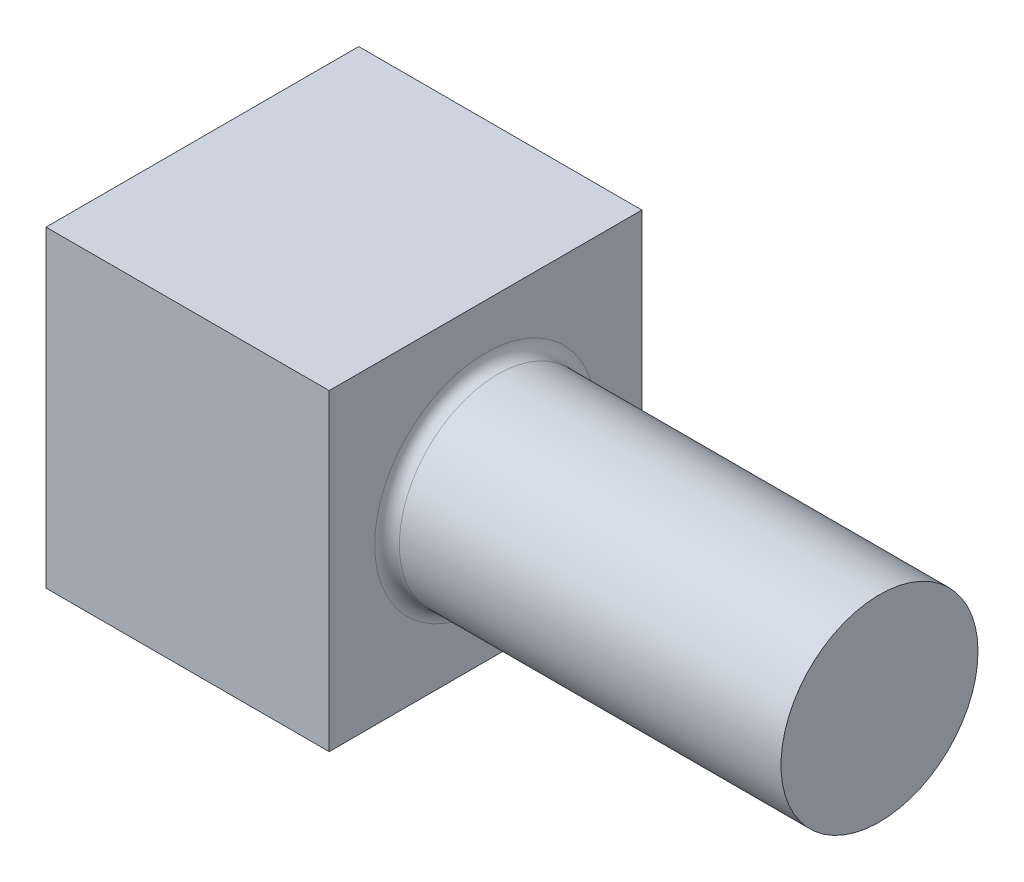
ISO-10303-21;
HEADER;
FILE_DESCRIPTION(('STEP AP214'),'2;1');
FILE_NAME('part.step','',(''),(''),'','','');
FILE_SCHEMA(('AUTOMOTIVE_DESIGN { 1 0 10303 214 1 1 1 1 }'));
ENDSEC;
DATA;
#1=APPLICATION_CONTEXT('core data for automotive mechanical design processes');
#2=APPLICATION_PROTOCOL_DEFINITION('international standard','automotive_design',2000,#1);
#3=PRODUCT_CONTEXT('',#1,'mechanical');
#4=PRODUCT('Part','Part','',(#3));
#5=PRODUCT_RELATED_PRODUCT_CATEGORY('part','',(#4));
#6=PRODUCT_DEFINITION_FORMATION('','',#4);
#7=PRODUCT_DEFINITION_CONTEXT('part definition',#1,'design');
#8=PRODUCT_DEFINITION('design','',#6,#7);
#9=PRODUCT_DEFINITION_SHAPE('','',#8);
#10=(LENGTH_UNIT() NAMED_UNIT(*) SI_UNIT(.MILLI.,.METRE.));
#11=(NAMED_UNIT(*) PLANE_ANGLE_UNIT() SI_UNIT($,.RADIAN.));
#12=(NAMED_UNIT(*) SI_UNIT($,.STERADIAN.) SOLID_ANGLE_UNIT());
#13=UNCERTAINTY_MEASURE_WITH_UNIT(LENGTH_MEASURE(1.E-05),#10,'distance_accuracy_value','');
#14=(GEOMETRIC_REPRESENTATION_CONTEXT(3) GLOBAL_UNCERTAINTY_ASSIGNED_CONTEXT((#13)) GLOBAL_UNIT_ASSIGNED_CONTEXT((#10,
#11,#12)) REPRESENTATION_CONTEXT('',''));
#15=CARTESIAN_POINT('',(0.,0.,0.));
#16=DIRECTION('',(0.,0.,1.));
#17=DIRECTION('',(1.,0.,0.));
#18=AXIS2_PLACEMENT_3D('',#15,#16,#17);
#19=CARTESIAN_POINT('',(12.,0.,0.));
#20=DIRECTION('',(1.,0.,0.));
#21=DIRECTION('',(0.,0.,-1.));
#22=AXIS2_PLACEMENT_3D('',#19,#20,#21);
#23=PLANE('',#22);
#24=CARTESIAN_POINT('',(12.,0.,0.));
#25=DIRECTION('',(1.,0.,0.));
#26=DIRECTION('',(0.,0.,-1.));
#27=AXIS2_PLACEMENT_3D('',#24,#25,#26);
#28=CIRCLE('',#27,4.5);
#29=CARTESIAN_POINT('',(12.,0.,-4.5));
#30=VERTEX_POINT('',#29);
#31=EDGE_CURVE('E118',#30,#30,#28,.F.);
#32=ORIENTED_EDGE('',*,*,#31,.T.);
#33=EDGE_LOOP('',(#32));
#34=FACE_BOUND('',#33,.T.);
#35=DIRECTION('',(0.,-1.,0.));
#36=VECTOR('',#35,1.);
#37=CARTESIAN_POINT('',(12.,6.35,6.35));
#38=LINE('',#37,#36);
#39=CARTESIAN_POINT('',(12.,6.35,6.35));
#40=VERTEX_POINT('',#39);
#41=CARTESIAN_POINT('',(12.,-6.35,6.35));
#42=VERTEX_POINT('',#41);
#43=EDGE_CURVE('E105',#40,#42,#38,.T.);
#44=ORIENTED_EDGE('',*,*,#43,.T.);
#45=DIRECTION('',(0.,0.,-1.));
#46=VECTOR('',#45,1.);
#47=CARTESIAN_POINT('',(12.,-6.35,6.35));
#48=LINE('',#47,#46);
#49=CARTESIAN_POINT('',(12.,-6.35,-6.35));
#50=VERTEX_POINT('',#49);
#51=EDGE_CURVE('E94',#42,#50,#48,.T.);
#52=ORIENTED_EDGE('',*,*,#51,.T.);
#53=DIRECTION('',(0.,1.,0.));
#54=VECTOR('',#53,1.);
#55=CARTESIAN_POINT('',(12.,6.35,-6.35));
#56=LINE('',#55,#54);
#57=CARTESIAN_POINT('',(12.,6.35,-6.35));
#58=VERTEX_POINT('',#57);
#59=EDGE_CURVE('E104',#50,#58,#56,.T.);
#60=ORIENTED_EDGE('',*,*,#59,.T.);
#61=DIRECTION('',(0.,0.,1.));
#62=VECTOR('',#61,1.);
#63=CARTESIAN_POINT('',(12.,6.35,6.35));
#64=LINE('',#63,#62);
#65=EDGE_CURVE('E109',#58,#40,#64,.T.);
#66=ORIENTED_EDGE('',*,*,#65,.T.);
#67=EDGE_LOOP('',(#44,#52,#60,#66));
#68=FACE_BOUND('',#67,.T.);
#69=ADVANCED_FACE('F38',(#34,#68),#23,.T.);
#70=CARTESIAN_POINT('',(12.,6.35,6.35));
#71=DIRECTION('',(0.,0.,-1.));
#72=DIRECTION('',(0.,1.,0.));
#73=AXIS2_PLACEMENT_3D('',#70,#71,#72);
#74=PLANE('',#73);
#75=DIRECTION('',(-1.,0.,0.));
#76=VECTOR('',#75,1.);
#77=CARTESIAN_POINT('',(12.,6.35,6.35));
#78=LINE('',#77,#76);
#79=CARTESIAN_POINT('',(0.500000000000007,6.35,6.35));
#80=VERTEX_POINT('',#79);
#81=EDGE_CURVE('E158',#40,#80,#78,.T.);
#82=ORIENTED_EDGE('',*,*,#81,.T.);
#83=DIRECTION('',(0.,-1.,0.));
#84=VECTOR('',#83,1.);
#85=CARTESIAN_POINT('',(0.500000000000007,6.35,6.35));
#86=LINE('',#85,#84);
#87=CARTESIAN_POINT('',(0.500000000000007,-6.35,6.35));
#88=VERTEX_POINT('',#87);
#89=EDGE_CURVE('E11',#80,#88,#86,.T.);
#90=ORIENTED_EDGE('',*,*,#89,.T.);
#91=DIRECTION('',(-1.,0.,0.));
#92=VECTOR('',#91,1.);
#93=CARTESIAN_POINT('',(12.,-6.35,6.35));
#94=LINE('',#93,#92);
#95=EDGE_CURVE('E99',#42,#88,#94,.T.);
#96=ORIENTED_EDGE('',*,*,#95,.F.);
#97=ORIENTED_EDGE('',*,*,#43,.F.);
#98=EDGE_LOOP('',(#82,#90,#96,#97));
#99=FACE_BOUND('',#98,.T.);
#100=ADVANCED_FACE('F113',(#99),#74,.F.);
#101=CARTESIAN_POINT('',(12.,-6.35,6.35));
#102=DIRECTION('',(0.,1.,0.));
#103=DIRECTION('',(0.,0.,1.));
#104=AXIS2_PLACEMENT_3D('',#101,#102,#103);
#105=PLANE('',#104);
#106=ORIENTED_EDGE('',*,*,#95,.T.);
#107=DIRECTION('',(0.,0.,-1.));
#108=VECTOR('',#107,1.);
#109=CARTESIAN_POINT('',(0.500000000000007,-6.35,6.35));
#110=LINE('',#109,#108);
#111=CARTESIAN_POINT('',(0.500000000000007,-6.35,-6.35));
#112=VERTEX_POINT('',#111);
#113=EDGE_CURVE('E126',#88,#112,#110,.T.);
#114=ORIENTED_EDGE('',*,*,#113,.T.);
#115=DIRECTION('',(-1.,0.,0.));
#116=VECTOR('',#115,1.);
#117=CARTESIAN_POINT('',(12.,-6.35,-6.35));
#118=LINE('',#117,#116);
#119=EDGE_CURVE('E101',#50,#112,#118,.T.);
#120=ORIENTED_EDGE('',*,*,#119,.F.);
#121=ORIENTED_EDGE('',*,*,#51,.F.);
#122=EDGE_LOOP('',(#106,#114,#120,#121));
#123=FACE_BOUND('',#122,.T.);
#124=ADVANCED_FACE('F96',(#123),#105,.F.);
#125=CARTESIAN_POINT('',(12.,6.35,-6.35));
#126=DIRECTION('',(0.,0.,1.));
#127=DIRECTION('',(0.,-1.,0.));
#128=AXIS2_PLACEMENT_3D('',#125,#126,#127);
#129=PLANE('',#128);
#130=ORIENTED_EDGE('',*,*,#119,.T.);
#131=DIRECTION('',(0.,1.,0.));
#132=VECTOR('',#131,1.);
#133=CARTESIAN_POINT('',(0.500000000000007,6.35,-6.35));
#134=LINE('',#133,#132);
#135=CARTESIAN_POINT('',(0.500000000000007,6.35,-6.35));
#136=VERTEX_POINT('',#135);
#137=EDGE_CURVE('E62',#112,#136,#134,.T.);
#138=ORIENTED_EDGE('',*,*,#137,.T.);
#139=DIRECTION('',(-1.,0.,0.));
#140=VECTOR('',#139,1.);
#141=CARTESIAN_POINT('',(12.,6.35,-6.35));
#142=LINE('',#141,#140);
#143=EDGE_CURVE('E120',#58,#136,#142,.T.);
#144=ORIENTED_EDGE('',*,*,#143,.F.);
#145=ORIENTED_EDGE('',*,*,#59,.F.);
#146=EDGE_LOOP('',(#130,#138,#144,#145));
#147=FACE_BOUND('',#146,.T.);
#148=ADVANCED_FACE('F168',(#147),#129,.F.);
#149=CARTESIAN_POINT('',(12.,6.35,6.35));
#150=DIRECTION('',(0.,-1.,0.));
#151=DIRECTION('',(0.,0.,-1.));
#152=AXIS2_PLACEMENT_3D('',#149,#150,#151);
#153=PLANE('',#152);
#154=ORIENTED_EDGE('',*,*,#143,.T.);
#155=DIRECTION('',(0.,0.,1.));
#156=VECTOR('',#155,1.);
#157=CARTESIAN_POINT('',(0.500000000000007,6.35,6.35));
#158=LINE('',#157,#156);
#159=EDGE_CURVE('E47',#136,#80,#158,.T.);
#160=ORIENTED_EDGE('',*,*,#159,.T.);
#161=ORIENTED_EDGE('',*,*,#81,.F.);
#162=ORIENTED_EDGE('',*,*,#65,.F.);
#163=EDGE_LOOP('',(#154,#160,#161,#162));
#164=FACE_BOUND('',#163,.T.);
#165=ADVANCED_FACE('F159',(#164),#153,.F.);
#166=CARTESIAN_POINT('',(0.,0.,0.));
#167=DIRECTION('',(1.,0.,0.));
#168=DIRECTION('',(0.,0.,-1.));
#169=AXIS2_PLACEMENT_3D('',#166,#167,#168);
#170=PLANE('',#169);
#171=DIRECTION('',(0.,-1.,0.));
#172=VECTOR('',#171,1.);
#173=CARTESIAN_POINT('',(0.,0.,-5.84999999999999));
#174=LINE('',#173,#172);
#175=CARTESIAN_POINT('',(0.,5.84999999999999,-5.84999999999999));
#176=VERTEX_POINT('',#175);
#177=CARTESIAN_POINT('',(0.,-5.84999999999999,-5.84999999999999));
#178=VERTEX_POINT('',#177);
#179=EDGE_CURVE('E132',#176,#178,#174,.T.);
#180=ORIENTED_EDGE('',*,*,#179,.T.);
#181=DIRECTION('',(0.,0.,1.));
#182=VECTOR('',#181,1.);
#183=CARTESIAN_POINT('',(0.,-5.84999999999999,0.));
#184=LINE('',#183,#182);
#185=CARTESIAN_POINT('',(0.,-5.84999999999999,5.84999999999999));
#186=VERTEX_POINT('',#185);
#187=EDGE_CURVE('E134',#178,#186,#184,.T.);
#188=ORIENTED_EDGE('',*,*,#187,.T.);
#189=DIRECTION('',(0.,1.,0.));
#190=VECTOR('',#189,1.);
#191=CARTESIAN_POINT('',(0.,0.,5.84999999999999));
#192=LINE('',#191,#190);
#193=CARTESIAN_POINT('',(0.,5.84999999999999,5.84999999999999));
#194=VERTEX_POINT('',#193);
#195=EDGE_CURVE('E128',#186,#194,#192,.T.);
#196=ORIENTED_EDGE('',*,*,#195,.T.);
#197=DIRECTION('',(0.,0.,-1.));
#198=VECTOR('',#197,1.);
#199=CARTESIAN_POINT('',(0.,5.84999999999999,0.));
#200=LINE('',#199,#198);
#201=EDGE_CURVE('E130',#194,#176,#200,.T.);
#202=ORIENTED_EDGE('',*,*,#201,.T.);
#203=EDGE_LOOP('',(#180,#188,#196,#202));
#204=FACE_BOUND('',#203,.T.);
#205=ADVANCED_FACE('F175',(#204),#170,.F.);
#206=CARTESIAN_POINT('',(28.,0.,0.));
#207=DIRECTION('',(-1.,0.,0.));
#208=DIRECTION('',(0.,0.,1.));
#209=AXIS2_PLACEMENT_3D('',#206,#207,#208);
#210=CYLINDRICAL_SURFACE('',#209,4.);
#211=CARTESIAN_POINT('',(12.5,0.,0.));
#212=DIRECTION('',(1.,0.,0.));
#213=DIRECTION('',(0.,0.,-1.));
#214=AXIS2_PLACEMENT_3D('',#211,#212,#213);
#215=CIRCLE('',#214,4.);
#216=CARTESIAN_POINT('',(12.5,0.,-4.));
#217=VERTEX_POINT('',#216);
#218=EDGE_CURVE('E115',#217,#217,#215,.T.);
#219=ORIENTED_EDGE('',*,*,#218,.T.);
#220=EDGE_LOOP('',(#219));
#221=FACE_BOUND('',#220,.T.);
#222=CARTESIAN_POINT('',(28.,0.,0.));
#223=DIRECTION('',(1.,0.,0.));
#224=DIRECTION('',(0.,0.,-1.));
#225=AXIS2_PLACEMENT_3D('',#222,#223,#224);
#226=CIRCLE('',#225,4.);
#227=CARTESIAN_POINT('',(28.,0.,-4.));
#228=VERTEX_POINT('',#227);
#229=EDGE_CURVE('E111',#228,#228,#226,.T.);
#230=ORIENTED_EDGE('',*,*,#229,.F.);
#231=EDGE_LOOP('',(#230));
#232=FACE_BOUND('',#231,.T.);
#233=ADVANCED_FACE('F187',(#221,#232),#210,.T.);
#234=CARTESIAN_POINT('',(28.,0.,0.));
#235=DIRECTION('',(1.,0.,0.));
#236=DIRECTION('',(0.,0.,-1.));
#237=AXIS2_PLACEMENT_3D('',#234,#235,#236);
#238=PLANE('',#237);
#239=ORIENTED_EDGE('',*,*,#229,.T.);
#240=EDGE_LOOP('',(#239));
#241=FACE_BOUND('',#240,.T.);
#242=ADVANCED_FACE('F194',(#241),#238,.T.);
#243=CARTESIAN_POINT('',(12.5,0.,0.));
#244=DIRECTION('',(1.,0.,0.));
#245=DIRECTION('',(0.,0.,-1.));
#246=AXIS2_PLACEMENT_3D('',#243,#244,#245);
#247=TOROIDAL_SURFACE('',#246,4.5,0.5);
#248=ORIENTED_EDGE('',*,*,#31,.F.);
#249=EDGE_LOOP('',(#248));
#250=FACE_BOUND('',#249,.T.);
#251=ORIENTED_EDGE('',*,*,#218,.F.);
#252=EDGE_LOOP('',(#251));
#253=FACE_BOUND('',#252,.T.);
#254=ADVANCED_FACE('F205',(#250,#253),#247,.F.);
#255=CARTESIAN_POINT('',(0.500000000000007,6.35,6.35));
#256=DIRECTION('',(0.70710678118655,-0.707106781186545,0.));
#257=DIRECTION('',(0.,0.,1.));
#258=AXIS2_PLACEMENT_3D('',#255,#256,#257);
#259=PLANE('',#258);
#260=DIRECTION('',(-0.577350269189623,-0.577350269189627,0.577350269189627));
#261=VECTOR('',#260,1.);
#262=CARTESIAN_POINT('',(-3.73333333333332,2.11666666666665,-2.11666666666665));
#263=LINE('',#262,#261);
#264=EDGE_CURVE('E142',#176,#136,#263,.F.);
#265=ORIENTED_EDGE('',*,*,#264,.F.);
#266=ORIENTED_EDGE('',*,*,#201,.F.);
#267=DIRECTION('',(-0.577350269189623,-0.577350269189627,-0.577350269189627));
#268=VECTOR('',#267,1.);
#269=CARTESIAN_POINT('',(0.500000000000007,6.35,6.35));
#270=LINE('',#269,#268);
#271=EDGE_CURVE('E42',#80,#194,#270,.T.);
#272=ORIENTED_EDGE('',*,*,#271,.F.);
#273=ORIENTED_EDGE('',*,*,#159,.F.);
#274=EDGE_LOOP('',(#265,#266,#272,#273));
#275=FACE_BOUND('',#274,.T.);
#276=ADVANCED_FACE('F40',(#275),#259,.F.);
#277=CARTESIAN_POINT('',(0.500000000000007,6.35,6.35));
#278=DIRECTION('',(0.70710678118655,0.,-0.707106781186545));
#279=DIRECTION('',(0.,-1.,0.));
#280=AXIS2_PLACEMENT_3D('',#277,#278,#279);
#281=PLANE('',#280);
#282=ORIENTED_EDGE('',*,*,#271,.T.);
#283=ORIENTED_EDGE('',*,*,#195,.F.);
#284=DIRECTION('',(0.577350269189623,-0.577350269189627,0.577350269189627));
#285=VECTOR('',#284,1.);
#286=CARTESIAN_POINT('',(-3.73333333333332,-2.11666666666665,2.11666666666665));
#287=LINE('',#286,#285);
#288=EDGE_CURVE('E141',#88,#186,#287,.F.);
#289=ORIENTED_EDGE('',*,*,#288,.F.);
#290=ORIENTED_EDGE('',*,*,#89,.F.);
#291=EDGE_LOOP('',(#282,#283,#289,#290));
#292=FACE_BOUND('',#291,.T.);
#293=ADVANCED_FACE('F162',(#292),#281,.F.);
#294=CARTESIAN_POINT('',(0.500000000000007,6.35,-6.35));
#295=DIRECTION('',(0.70710678118655,0.,0.707106781186545));
#296=DIRECTION('',(0.,1.,0.));
#297=AXIS2_PLACEMENT_3D('',#294,#295,#296);
#298=PLANE('',#297);
#299=ORIENTED_EDGE('',*,*,#264,.T.);
#300=ORIENTED_EDGE('',*,*,#137,.F.);
#301=DIRECTION('',(-0.577350269189623,0.577350269189627,0.577350269189627));
#302=VECTOR('',#301,1.);
#303=CARTESIAN_POINT('',(-3.73333333333332,-2.11666666666665,-2.11666666666665));
#304=LINE('',#303,#302);
#305=EDGE_CURVE('E139',#178,#112,#304,.F.);
#306=ORIENTED_EDGE('',*,*,#305,.F.);
#307=ORIENTED_EDGE('',*,*,#179,.F.);
#308=EDGE_LOOP('',(#299,#300,#306,#307));
#309=FACE_BOUND('',#308,.T.);
#310=ADVANCED_FACE('F196',(#309),#298,.F.);
#311=CARTESIAN_POINT('',(0.500000000000007,-6.35,6.35));
#312=DIRECTION('',(0.70710678118655,0.707106781186545,0.));
#313=DIRECTION('',(0.,0.,-1.));
#314=AXIS2_PLACEMENT_3D('',#311,#312,#313);
#315=PLANE('',#314);
#316=ORIENTED_EDGE('',*,*,#288,.T.);
#317=ORIENTED_EDGE('',*,*,#187,.F.);
#318=ORIENTED_EDGE('',*,*,#305,.T.);
#319=ORIENTED_EDGE('',*,*,#113,.F.);
#320=EDGE_LOOP('',(#316,#317,#318,#319));
#321=FACE_BOUND('',#320,.T.);
#322=ADVANCED_FACE('F166',(#321),#315,.F.);
#323=CLOSED_SHELL('',(#69,#100,#124,#148,#165,#205,#233,#242,#254,#276,#293,#310,#322));
#324=MANIFOLD_SOLID_BREP('B2',#323);
#325=ADVANCED_BREP_SHAPE_REPRESENTATION('',(#18,#324),#14);
#326=SHAPE_DEFINITION_REPRESENTATION(#9,#325);
ENDSEC;
END-ISO-10303-21;
